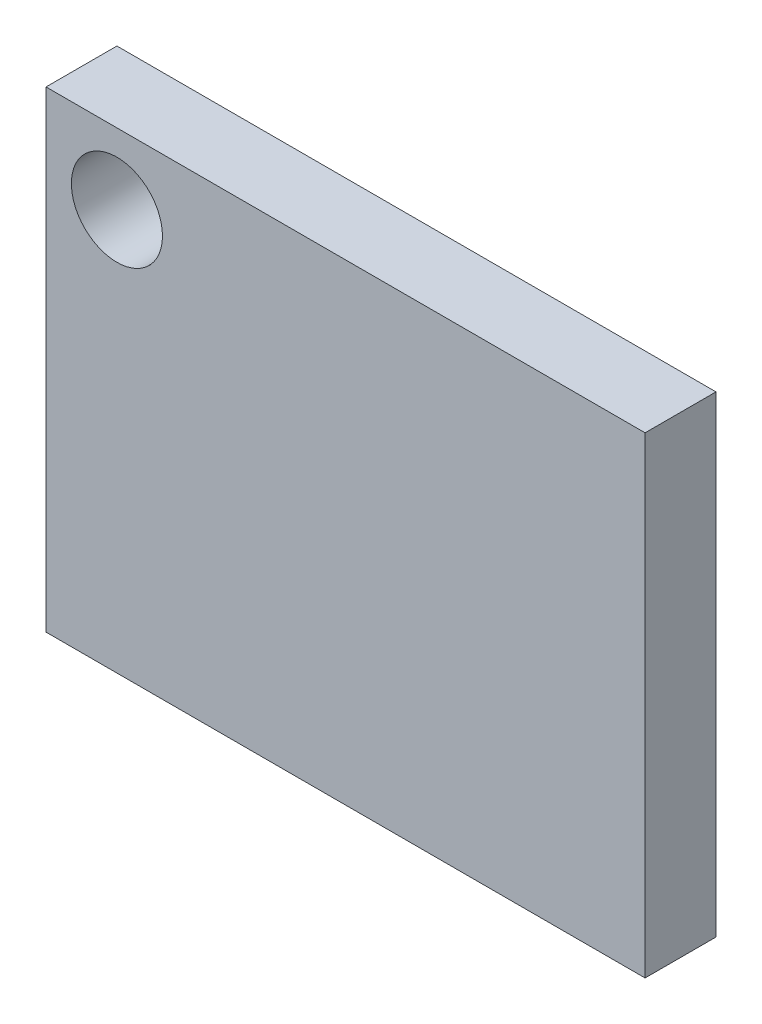
ISO-10303-21;
HEADER;
FILE_DESCRIPTION(('STEP AP214'),'2;1');
FILE_NAME('part.step','',(''),(''),'','','');
FILE_SCHEMA(('AUTOMOTIVE_DESIGN { 1 0 10303 214 1 1 1 1 }'));
ENDSEC;
DATA;
#1=APPLICATION_CONTEXT('core data for automotive mechanical design processes');
#2=APPLICATION_PROTOCOL_DEFINITION('international standard','automotive_design',2000,#1);
#3=PRODUCT_CONTEXT('',#1,'mechanical');
#4=PRODUCT('Part','Part','',(#3));
#5=PRODUCT_RELATED_PRODUCT_CATEGORY('part','',(#4));
#6=PRODUCT_DEFINITION_FORMATION('','',#4);
#7=PRODUCT_DEFINITION_CONTEXT('part definition',#1,'design');
#8=PRODUCT_DEFINITION('design','',#6,#7);
#9=PRODUCT_DEFINITION_SHAPE('','',#8);
#10=(LENGTH_UNIT() NAMED_UNIT(*) SI_UNIT(.MILLI.,.METRE.));
#11=(NAMED_UNIT(*) PLANE_ANGLE_UNIT() SI_UNIT($,.RADIAN.));
#12=(NAMED_UNIT(*) SI_UNIT($,.STERADIAN.) SOLID_ANGLE_UNIT());
#13=UNCERTAINTY_MEASURE_WITH_UNIT(LENGTH_MEASURE(1.E-05),#10,'distance_accuracy_value','');
#14=(GEOMETRIC_REPRESENTATION_CONTEXT(3) GLOBAL_UNCERTAINTY_ASSIGNED_CONTEXT((#13)) GLOBAL_UNIT_ASSIGNED_CONTEXT((#10,
#11,#12)) REPRESENTATION_CONTEXT('',''));
#15=CARTESIAN_POINT('',(0.,0.,0.));
#16=DIRECTION('',(0.,0.,1.));
#17=DIRECTION('',(1.,0.,0.));
#18=AXIS2_PLACEMENT_3D('',#15,#16,#17);
#19=CARTESIAN_POINT('',(10.7315,-8.4582,2.54));
#20=DIRECTION('',(-1.,0.,0.));
#21=DIRECTION('',(0.,0.,1.));
#22=AXIS2_PLACEMENT_3D('',#19,#20,#21);
#23=PLANE('',#22);
#24=DIRECTION('',(0.,1.,0.));
#25=VECTOR('',#24,1.);
#26=CARTESIAN_POINT('',(10.7315,-8.4582,0.));
#27=LINE('',#26,#25);
#28=CARTESIAN_POINT('',(10.7315,-8.4582,0.));
#29=VERTEX_POINT('',#28);
#30=CARTESIAN_POINT('',(10.7315,8.4582,0.));
#31=VERTEX_POINT('',#30);
#32=EDGE_CURVE('E96',#29,#31,#27,.T.);
#33=ORIENTED_EDGE('',*,*,#32,.T.);
#34=DIRECTION('',(0.,0.,-1.));
#35=VECTOR('',#34,1.);
#36=CARTESIAN_POINT('',(10.7315,8.4582,2.54));
#37=LINE('',#36,#35);
#38=CARTESIAN_POINT('',(10.7315,8.4582,2.54));
#39=VERTEX_POINT('',#38);
#40=EDGE_CURVE('E11',#39,#31,#37,.T.);
#41=ORIENTED_EDGE('',*,*,#40,.F.);
#42=DIRECTION('',(0.,1.,0.));
#43=VECTOR('',#42,1.);
#44=CARTESIAN_POINT('',(10.7315,-8.4582,2.54));
#45=LINE('',#44,#43);
#46=CARTESIAN_POINT('',(10.7315,-8.4582,2.54));
#47=VERTEX_POINT('',#46);
#48=EDGE_CURVE('E84',#47,#39,#45,.T.);
#49=ORIENTED_EDGE('',*,*,#48,.F.);
#50=DIRECTION('',(0.,0.,-1.));
#51=VECTOR('',#50,1.);
#52=CARTESIAN_POINT('',(10.7315,-8.4582,2.54));
#53=LINE('',#52,#51);
#54=EDGE_CURVE('E92',#47,#29,#53,.T.);
#55=ORIENTED_EDGE('',*,*,#54,.T.);
#56=EDGE_LOOP('',(#33,#41,#49,#55));
#57=FACE_BOUND('',#56,.T.);
#58=ADVANCED_FACE('F33',(#57),#23,.F.);
#59=CARTESIAN_POINT('',(-10.7315,8.4582,2.54));
#60=DIRECTION('',(0.,-1.,0.));
#61=DIRECTION('',(0.,0.,-1.));
#62=AXIS2_PLACEMENT_3D('',#59,#60,#61);
#63=PLANE('',#62);
#64=DIRECTION('',(-1.,0.,0.));
#65=VECTOR('',#64,1.);
#66=CARTESIAN_POINT('',(-10.7315,8.4582,0.));
#67=LINE('',#66,#65);
#68=CARTESIAN_POINT('',(-10.7315,8.4582,0.));
#69=VERTEX_POINT('',#68);
#70=EDGE_CURVE('E88',#31,#69,#67,.T.);
#71=ORIENTED_EDGE('',*,*,#70,.T.);
#72=DIRECTION('',(0.,0.,-1.));
#73=VECTOR('',#72,1.);
#74=CARTESIAN_POINT('',(-10.7315,8.4582,2.54));
#75=LINE('',#74,#73);
#76=CARTESIAN_POINT('',(-10.7315,8.4582,2.54));
#77=VERTEX_POINT('',#76);
#78=EDGE_CURVE('E41',#77,#69,#75,.T.);
#79=ORIENTED_EDGE('',*,*,#78,.F.);
#80=DIRECTION('',(-1.,0.,0.));
#81=VECTOR('',#80,1.);
#82=CARTESIAN_POINT('',(-10.7315,8.4582,2.54));
#83=LINE('',#82,#81);
#84=EDGE_CURVE('E79',#39,#77,#83,.T.);
#85=ORIENTED_EDGE('',*,*,#84,.F.);
#86=ORIENTED_EDGE('',*,*,#40,.T.);
#87=EDGE_LOOP('',(#71,#79,#85,#86));
#88=FACE_BOUND('',#87,.T.);
#89=ADVANCED_FACE('F87',(#88),#63,.F.);
#90=CARTESIAN_POINT('',(-10.7315,-8.4582,2.54));
#91=DIRECTION('',(1.,0.,0.));
#92=DIRECTION('',(0.,0.,-1.));
#93=AXIS2_PLACEMENT_3D('',#90,#91,#92);
#94=PLANE('',#93);
#95=DIRECTION('',(0.,-1.,0.));
#96=VECTOR('',#95,1.);
#97=CARTESIAN_POINT('',(-10.7315,-8.4582,0.));
#98=LINE('',#97,#96);
#99=CARTESIAN_POINT('',(-10.7315,-8.4582,0.));
#100=VERTEX_POINT('',#99);
#101=EDGE_CURVE('E66',#69,#100,#98,.T.);
#102=ORIENTED_EDGE('',*,*,#101,.T.);
#103=DIRECTION('',(0.,0.,-1.));
#104=VECTOR('',#103,1.);
#105=CARTESIAN_POINT('',(-10.7315,-8.4582,2.54));
#106=LINE('',#105,#104);
#107=CARTESIAN_POINT('',(-10.7315,-8.4582,2.54));
#108=VERTEX_POINT('',#107);
#109=EDGE_CURVE('E89',#108,#100,#106,.T.);
#110=ORIENTED_EDGE('',*,*,#109,.F.);
#111=DIRECTION('',(0.,-1.,0.));
#112=VECTOR('',#111,1.);
#113=CARTESIAN_POINT('',(-10.7315,-8.4582,2.54));
#114=LINE('',#113,#112);
#115=EDGE_CURVE('E82',#77,#108,#114,.T.);
#116=ORIENTED_EDGE('',*,*,#115,.F.);
#117=ORIENTED_EDGE('',*,*,#78,.T.);
#118=EDGE_LOOP('',(#102,#110,#116,#117));
#119=FACE_BOUND('',#118,.T.);
#120=ADVANCED_FACE('F90',(#119),#94,.F.);
#121=CARTESIAN_POINT('',(-10.7315,-8.4582,2.54));
#122=DIRECTION('',(0.,1.,0.));
#123=DIRECTION('',(0.,0.,1.));
#124=AXIS2_PLACEMENT_3D('',#121,#122,#123);
#125=PLANE('',#124);
#126=DIRECTION('',(1.,0.,0.));
#127=VECTOR('',#126,1.);
#128=CARTESIAN_POINT('',(-10.7315,-8.4582,0.));
#129=LINE('',#128,#127);
#130=EDGE_CURVE('E72',#100,#29,#129,.T.);
#131=ORIENTED_EDGE('',*,*,#130,.T.);
#132=ORIENTED_EDGE('',*,*,#54,.F.);
#133=DIRECTION('',(1.,0.,0.));
#134=VECTOR('',#133,1.);
#135=CARTESIAN_POINT('',(-10.7315,-8.4582,2.54));
#136=LINE('',#135,#134);
#137=EDGE_CURVE('E49',#108,#47,#136,.T.);
#138=ORIENTED_EDGE('',*,*,#137,.F.);
#139=ORIENTED_EDGE('',*,*,#109,.T.);
#140=EDGE_LOOP('',(#131,#132,#138,#139));
#141=FACE_BOUND('',#140,.T.);
#142=ADVANCED_FACE('F104',(#141),#125,.F.);
#143=CARTESIAN_POINT('',(0.,0.,2.54));
#144=DIRECTION('',(0.,0.,-1.));
#145=DIRECTION('',(-1.,0.,0.));
#146=AXIS2_PLACEMENT_3D('',#143,#144,#145);
#147=PLANE('',#146);
#148=CARTESIAN_POINT('',(-8.1915,5.9182,2.54));
#149=DIRECTION('',(0.,0.,1.));
#150=DIRECTION('',(1.,0.,0.));
#151=AXIS2_PLACEMENT_3D('',#148,#149,#150);
#152=CIRCLE('',#151,1.63194999999999);
#153=CARTESIAN_POINT('',(-6.55955000000001,5.9182,2.54));
#154=VERTEX_POINT('',#153);
#155=EDGE_CURVE('E112',#154,#154,#152,.T.);
#156=ORIENTED_EDGE('',*,*,#155,.F.);
#157=EDGE_LOOP('',(#156));
#158=FACE_BOUND('',#157,.T.);
#159=ORIENTED_EDGE('',*,*,#48,.T.);
#160=ORIENTED_EDGE('',*,*,#84,.T.);
#161=ORIENTED_EDGE('',*,*,#115,.T.);
#162=ORIENTED_EDGE('',*,*,#137,.T.);
#163=EDGE_LOOP('',(#159,#160,#161,#162));
#164=FACE_BOUND('',#163,.T.);
#165=ADVANCED_FACE('F80',(#158,#164),#147,.F.);
#166=CARTESIAN_POINT('',(0.,0.,0.));
#167=DIRECTION('',(0.,0.,-1.));
#168=DIRECTION('',(-1.,0.,0.));
#169=AXIS2_PLACEMENT_3D('',#166,#167,#168);
#170=PLANE('',#169);
#171=CARTESIAN_POINT('',(-8.1915,5.9182,0.));
#172=DIRECTION('',(0.,0.,1.));
#173=DIRECTION('',(1.,0.,0.));
#174=AXIS2_PLACEMENT_3D('',#171,#172,#173);
#175=CIRCLE('',#174,1.63195);
#176=CARTESIAN_POINT('',(-6.55955,5.9182,0.));
#177=VERTEX_POINT('',#176);
#178=EDGE_CURVE('E99',#177,#177,#175,.T.);
#179=ORIENTED_EDGE('',*,*,#178,.T.);
#180=EDGE_LOOP('',(#179));
#181=FACE_BOUND('',#180,.T.);
#182=ORIENTED_EDGE('',*,*,#32,.F.);
#183=ORIENTED_EDGE('',*,*,#130,.F.);
#184=ORIENTED_EDGE('',*,*,#101,.F.);
#185=ORIENTED_EDGE('',*,*,#70,.F.);
#186=EDGE_LOOP('',(#182,#183,#184,#185));
#187=FACE_BOUND('',#186,.T.);
#188=ADVANCED_FACE('F107',(#181,#187),#170,.T.);
#189=CARTESIAN_POINT('',(-8.1915,5.9182,2.54));
#190=DIRECTION('',(0.,0.,1.));
#191=DIRECTION('',(1.,0.,0.));
#192=AXIS2_PLACEMENT_3D('',#189,#190,#191);
#193=CYLINDRICAL_SURFACE('',#192,1.63194999999999);
#194=ORIENTED_EDGE('',*,*,#178,.F.);
#195=EDGE_LOOP('',(#194));
#196=FACE_BOUND('',#195,.T.);
#197=ORIENTED_EDGE('',*,*,#155,.T.);
#198=EDGE_LOOP('',(#197));
#199=FACE_BOUND('',#198,.T.);
#200=ADVANCED_FACE('F116',(#196,#199),#193,.F.);
#201=CLOSED_SHELL('',(#58,#89,#120,#142,#165,#188,#200));
#202=MANIFOLD_SOLID_BREP('B2',#201);
#203=ADVANCED_BREP_SHAPE_REPRESENTATION('',(#18,#202),#14);
#204=SHAPE_DEFINITION_REPRESENTATION(#9,#203);
ENDSEC;
END-ISO-10303-21;
